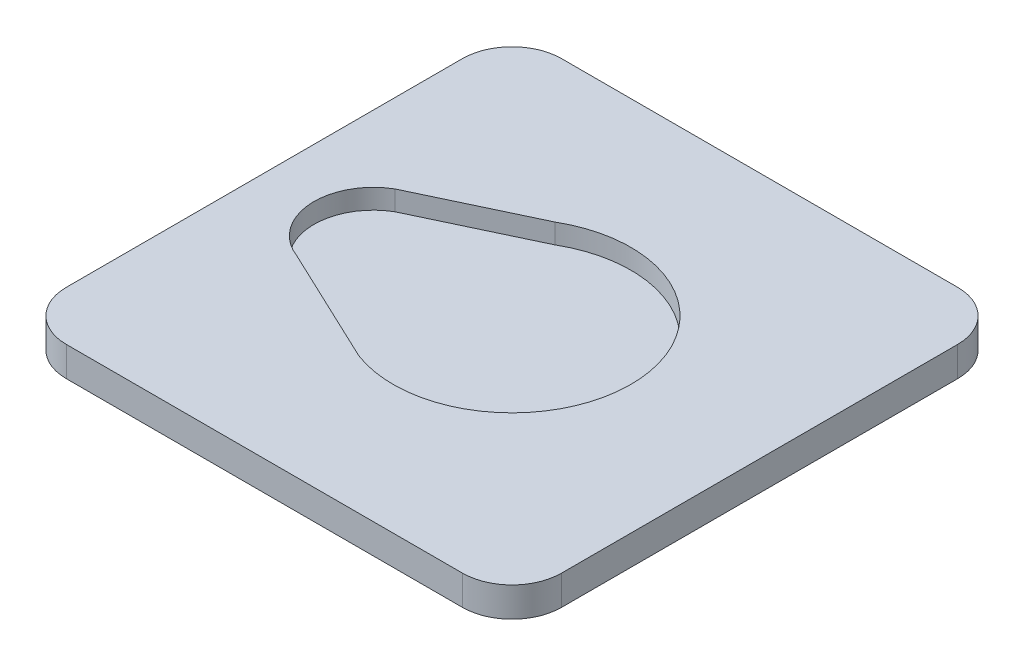
ISO-10303-21;
HEADER;
FILE_DESCRIPTION(('STEP AP214'),'2;1');
FILE_NAME('part.step','',(''),(''),'','','');
FILE_SCHEMA(('AUTOMOTIVE_DESIGN { 1 0 10303 214 1 1 1 1 }'));
ENDSEC;
DATA;
#1=APPLICATION_CONTEXT('core data for automotive mechanical design processes');
#2=APPLICATION_PROTOCOL_DEFINITION('international standard','automotive_design',2000,#1);
#3=PRODUCT_CONTEXT('',#1,'mechanical');
#4=PRODUCT('Part','Part','',(#3));
#5=PRODUCT_RELATED_PRODUCT_CATEGORY('part','',(#4));
#6=PRODUCT_DEFINITION_FORMATION('','',#4);
#7=PRODUCT_DEFINITION_CONTEXT('part definition',#1,'design');
#8=PRODUCT_DEFINITION('design','',#6,#7);
#9=PRODUCT_DEFINITION_SHAPE('','',#8);
#10=(LENGTH_UNIT() NAMED_UNIT(*) SI_UNIT(.MILLI.,.METRE.));
#11=(NAMED_UNIT(*) PLANE_ANGLE_UNIT() SI_UNIT($,.RADIAN.));
#12=(NAMED_UNIT(*) SI_UNIT($,.STERADIAN.) SOLID_ANGLE_UNIT());
#13=UNCERTAINTY_MEASURE_WITH_UNIT(LENGTH_MEASURE(1.E-05),#10,'distance_accuracy_value','');
#14=(GEOMETRIC_REPRESENTATION_CONTEXT(3) GLOBAL_UNCERTAINTY_ASSIGNED_CONTEXT((#13)) GLOBAL_UNIT_ASSIGNED_CONTEXT((#10,
#11,#12)) REPRESENTATION_CONTEXT('',''));
#15=CARTESIAN_POINT('',(0.,0.,0.));
#16=DIRECTION('',(0.,0.,1.));
#17=DIRECTION('',(1.,0.,0.));
#18=AXIS2_PLACEMENT_3D('',#15,#16,#17);
#19=CARTESIAN_POINT('',(0.,15.,0.));
#20=DIRECTION('',(0.,-1.,0.));
#21=DIRECTION('',(0.,0.,-1.));
#22=AXIS2_PLACEMENT_3D('',#19,#20,#21);
#23=CYLINDRICAL_SURFACE('',#22,60.);
#24=DIRECTION('',(0.,-1.,0.));
#25=VECTOR('',#24,1.);
#26=CARTESIAN_POINT('',(-30.0805669917219,15.,-51.9149254979388));
#27=LINE('',#26,#25);
#28=CARTESIAN_POINT('',(-30.0805669917219,15.,-51.9149254979388));
#29=VERTEX_POINT('',#28);
#30=CARTESIAN_POINT('',(-30.0805669917219,5.,-51.9149254979388));
#31=VERTEX_POINT('',#30);
#32=EDGE_CURVE('E210',#29,#31,#27,.T.);
#33=ORIENTED_EDGE('',*,*,#32,.T.);
#34=CARTESIAN_POINT('',(0.,5.,0.));
#35=DIRECTION('',(0.,-1.,0.));
#36=DIRECTION('',(0.,0.,-1.));
#37=AXIS2_PLACEMENT_3D('',#34,#35,#36);
#38=CIRCLE('',#37,60.);
#39=CARTESIAN_POINT('',(-21.1741904659975,5.,56.1395908259907));
#40=VERTEX_POINT('',#39);
#41=EDGE_CURVE('E189',#31,#40,#38,.T.);
#42=ORIENTED_EDGE('',*,*,#41,.T.);
#43=DIRECTION('',(0.,-1.,0.));
#44=VECTOR('',#43,1.);
#45=CARTESIAN_POINT('',(-21.1741904659976,15.,56.1395908259907));
#46=LINE('',#45,#44);
#47=CARTESIAN_POINT('',(-21.1741904659976,15.,56.1395908259907));
#48=VERTEX_POINT('',#47);
#49=EDGE_CURVE('E201',#48,#40,#46,.T.);
#50=ORIENTED_EDGE('',*,*,#49,.F.);
#51=CARTESIAN_POINT('',(0.,15.,0.));
#52=DIRECTION('',(0.,1.,0.));
#53=DIRECTION('',(0.,0.,1.));
#54=AXIS2_PLACEMENT_3D('',#51,#52,#53);
#55=CIRCLE('',#54,60.);
#56=EDGE_CURVE('E192',#48,#29,#55,.T.);
#57=ORIENTED_EDGE('',*,*,#56,.T.);
#58=EDGE_LOOP('',(#33,#42,#50,#57));
#59=FACE_BOUND('',#58,.T.);
#60=ADVANCED_FACE('F35',(#59),#23,.F.);
#61=CARTESIAN_POINT('',(-30.0805669917219,15.,-51.9149254979388));
#62=DIRECTION('',(0.427063656850554,0.,0.904221561895884));
#63=DIRECTION('',(0.904221561895884,0.,-0.427063656850554));
#64=AXIS2_PLACEMENT_3D('',#61,#62,#63);
#65=PLANE('',#64);
#66=DIRECTION('',(0.,-1.,0.));
#67=VECTOR('',#66,1.);
#68=CARTESIAN_POINT('',(-85.040283495861,15.,-25.9574627489694));
#69=LINE('',#68,#67);
#70=CARTESIAN_POINT('',(-85.040283495861,15.,-25.9574627489694));
#71=VERTEX_POINT('',#70);
#72=CARTESIAN_POINT('',(-85.040283495861,5.,-25.9574627489694));
#73=VERTEX_POINT('',#72);
#74=EDGE_CURVE('E207',#71,#73,#69,.T.);
#75=ORIENTED_EDGE('',*,*,#74,.T.);
#76=DIRECTION('',(0.904221561895884,0.,-0.427063656850554));
#77=VECTOR('',#76,1.);
#78=CARTESIAN_POINT('',(-30.0805669917219,5.,-51.9149254979388));
#79=LINE('',#78,#77);
#80=EDGE_CURVE('E186',#73,#31,#79,.T.);
#81=ORIENTED_EDGE('',*,*,#80,.T.);
#82=ORIENTED_EDGE('',*,*,#32,.F.);
#83=DIRECTION('',(-0.904221561895884,0.,0.427063656850554));
#84=VECTOR('',#83,1.);
#85=CARTESIAN_POINT('',(-30.0805669917219,15.,-51.9149254979388));
#86=LINE('',#85,#84);
#87=EDGE_CURVE('E194',#29,#71,#86,.T.);
#88=ORIENTED_EDGE('',*,*,#87,.T.);
#89=EDGE_LOOP('',(#75,#81,#82,#88));
#90=FACE_BOUND('',#89,.T.);
#91=ADVANCED_FACE('F320',(#90),#65,.T.);
#92=CARTESIAN_POINT('',(-70.0000000000001,15.,0.));
#93=DIRECTION('',(0.,-1.,0.));
#94=DIRECTION('',(0.,0.,-1.));
#95=AXIS2_PLACEMENT_3D('',#92,#93,#94);
#96=CYLINDRICAL_SURFACE('',#95,30.);
#97=DIRECTION('',(0.,-1.,0.));
#98=VECTOR('',#97,1.);
#99=CARTESIAN_POINT('',(-80.5870952329988,15.,28.0697954129954));
#100=LINE('',#99,#98);
#101=CARTESIAN_POINT('',(-80.5870952329988,15.,28.0697954129954));
#102=VERTEX_POINT('',#101);
#103=CARTESIAN_POINT('',(-80.5870952329988,5.,28.0697954129954));
#104=VERTEX_POINT('',#103);
#105=EDGE_CURVE('E204',#102,#104,#100,.T.);
#106=ORIENTED_EDGE('',*,*,#105,.T.);
#107=CARTESIAN_POINT('',(-70.0000000000001,5.,0.));
#108=DIRECTION('',(0.,-1.,0.));
#109=DIRECTION('',(0.,0.,-1.));
#110=AXIS2_PLACEMENT_3D('',#107,#108,#109);
#111=CIRCLE('',#110,30.);
#112=EDGE_CURVE('E58',#104,#73,#111,.T.);
#113=ORIENTED_EDGE('',*,*,#112,.T.);
#114=ORIENTED_EDGE('',*,*,#74,.F.);
#115=CARTESIAN_POINT('',(-70.0000000000001,15.,0.));
#116=DIRECTION('',(0.,1.,0.));
#117=DIRECTION('',(0.,0.,1.));
#118=AXIS2_PLACEMENT_3D('',#115,#116,#117);
#119=CIRCLE('',#118,30.);
#120=EDGE_CURVE('E196',#71,#102,#119,.T.);
#121=ORIENTED_EDGE('',*,*,#120,.T.);
#122=EDGE_LOOP('',(#106,#113,#114,#121));
#123=FACE_BOUND('',#122,.T.);
#124=ADVANCED_FACE('F322',(#123),#96,.F.);
#125=CARTESIAN_POINT('',(-80.5870952329988,15.,28.0697954129954));
#126=DIRECTION('',(0.427176792996559,0.,-0.904168119060374));
#127=DIRECTION('',(-0.904168119060374,0.,-0.427176792996559));
#128=AXIS2_PLACEMENT_3D('',#125,#126,#127);
#129=PLANE('',#128);
#130=ORIENTED_EDGE('',*,*,#49,.T.);
#131=DIRECTION('',(-0.904168119060374,0.,-0.427176792996559));
#132=VECTOR('',#131,1.);
#133=CARTESIAN_POINT('',(-80.5870952329988,5.,28.0697954129954));
#134=LINE('',#133,#132);
#135=EDGE_CURVE('E11',#40,#104,#134,.T.);
#136=ORIENTED_EDGE('',*,*,#135,.T.);
#137=ORIENTED_EDGE('',*,*,#105,.F.);
#138=DIRECTION('',(0.904168119060374,0.,0.427176792996559));
#139=VECTOR('',#138,1.);
#140=CARTESIAN_POINT('',(-80.5870952329988,15.,28.0697954129954));
#141=LINE('',#140,#139);
#142=EDGE_CURVE('E199',#102,#48,#141,.T.);
#143=ORIENTED_EDGE('',*,*,#142,.T.);
#144=EDGE_LOOP('',(#130,#136,#137,#143));
#145=FACE_BOUND('',#144,.T.);
#146=ADVANCED_FACE('F311',(#145),#129,.T.);
#147=CARTESIAN_POINT('',(100.,15.,100.));
#148=DIRECTION('',(0.,1.,0.));
#149=DIRECTION('',(0.,0.,1.));
#150=AXIS2_PLACEMENT_3D('',#147,#148,#149);
#151=PLANE('',#150);
#152=CARTESIAN_POINT('',(100.,15.,100.));
#153=DIRECTION('',(0.,1.,0.));
#154=DIRECTION('',(0.,0.,1.));
#155=AXIS2_PLACEMENT_3D('',#152,#153,#154);
#156=CIRCLE('',#155,25.);
#157=CARTESIAN_POINT('',(100.,15.,125.));
#158=VERTEX_POINT('',#157);
#159=CARTESIAN_POINT('',(125.,15.,100.));
#160=VERTEX_POINT('',#159);
#161=EDGE_CURVE('E214',#158,#160,#156,.T.);
#162=ORIENTED_EDGE('',*,*,#161,.T.);
#163=DIRECTION('',(0.,0.,-1.));
#164=VECTOR('',#163,1.);
#165=CARTESIAN_POINT('',(125.,15.,-100.));
#166=LINE('',#165,#164);
#167=CARTESIAN_POINT('',(125.,15.,-100.));
#168=VERTEX_POINT('',#167);
#169=EDGE_CURVE('E217',#160,#168,#166,.T.);
#170=ORIENTED_EDGE('',*,*,#169,.T.);
#171=CARTESIAN_POINT('',(100.,15.,-100.));
#172=DIRECTION('',(0.,1.,0.));
#173=DIRECTION('',(0.,0.,-1.));
#174=AXIS2_PLACEMENT_3D('',#171,#172,#173);
#175=CIRCLE('',#174,25.);
#176=CARTESIAN_POINT('',(100.,15.,-125.));
#177=VERTEX_POINT('',#176);
#178=EDGE_CURVE('E220',#168,#177,#175,.T.);
#179=ORIENTED_EDGE('',*,*,#178,.T.);
#180=DIRECTION('',(-1.,0.,0.));
#181=VECTOR('',#180,1.);
#182=CARTESIAN_POINT('',(-100.,15.,-125.));
#183=LINE('',#182,#181);
#184=CARTESIAN_POINT('',(-100.,15.,-125.));
#185=VERTEX_POINT('',#184);
#186=EDGE_CURVE('E222',#177,#185,#183,.T.);
#187=ORIENTED_EDGE('',*,*,#186,.T.);
#188=CARTESIAN_POINT('',(-100.,15.,-100.));
#189=DIRECTION('',(0.,1.,0.));
#190=DIRECTION('',(0.,0.,-1.));
#191=AXIS2_PLACEMENT_3D('',#188,#189,#190);
#192=CIRCLE('',#191,25.);
#193=CARTESIAN_POINT('',(-125.,15.,-100.));
#194=VERTEX_POINT('',#193);
#195=EDGE_CURVE('E224',#185,#194,#192,.T.);
#196=ORIENTED_EDGE('',*,*,#195,.T.);
#197=DIRECTION('',(0.,0.,1.));
#198=VECTOR('',#197,1.);
#199=CARTESIAN_POINT('',(-125.,15.,-100.));
#200=LINE('',#199,#198);
#201=CARTESIAN_POINT('',(-125.,15.,100.));
#202=VERTEX_POINT('',#201);
#203=EDGE_CURVE('E226',#194,#202,#200,.T.);
#204=ORIENTED_EDGE('',*,*,#203,.T.);
#205=CARTESIAN_POINT('',(-100.,15.,100.));
#206=DIRECTION('',(0.,1.,0.));
#207=DIRECTION('',(0.,0.,1.));
#208=AXIS2_PLACEMENT_3D('',#205,#206,#207);
#209=CIRCLE('',#208,25.);
#210=CARTESIAN_POINT('',(-100.,15.,125.));
#211=VERTEX_POINT('',#210);
#212=EDGE_CURVE('E228',#202,#211,#209,.T.);
#213=ORIENTED_EDGE('',*,*,#212,.T.);
#214=DIRECTION('',(1.,0.,0.));
#215=VECTOR('',#214,1.);
#216=CARTESIAN_POINT('',(-100.,15.,125.));
#217=LINE('',#216,#215);
#218=EDGE_CURVE('E230',#211,#158,#217,.T.);
#219=ORIENTED_EDGE('',*,*,#218,.T.);
#220=EDGE_LOOP('',(#162,#170,#179,#187,#196,#204,#213,#219));
#221=FACE_BOUND('',#220,.T.);
#222=ORIENTED_EDGE('',*,*,#87,.F.);
#223=ORIENTED_EDGE('',*,*,#56,.F.);
#224=ORIENTED_EDGE('',*,*,#142,.F.);
#225=ORIENTED_EDGE('',*,*,#120,.F.);
#226=EDGE_LOOP('',(#222,#223,#224,#225));
#227=FACE_BOUND('',#226,.T.);
#228=ADVANCED_FACE('F308',(#221,#227),#151,.T.);
#229=CARTESIAN_POINT('',(100.,0.,100.));
#230=DIRECTION('',(0.,1.,0.));
#231=DIRECTION('',(0.,0.,1.));
#232=AXIS2_PLACEMENT_3D('',#229,#230,#231);
#233=PLANE('',#232);
#234=DIRECTION('',(-1.,0.,0.));
#235=VECTOR('',#234,1.);
#236=CARTESIAN_POINT('',(100.,0.,100.));
#237=LINE('',#236,#235);
#238=CARTESIAN_POINT('',(100.,0.,100.));
#239=VERTEX_POINT('',#238);
#240=CARTESIAN_POINT('',(-100.,0.,100.));
#241=VERTEX_POINT('',#240);
#242=EDGE_CURVE('E176',#239,#241,#237,.T.);
#243=ORIENTED_EDGE('',*,*,#242,.F.);
#244=DIRECTION('',(0.,0.,1.));
#245=VECTOR('',#244,1.);
#246=CARTESIAN_POINT('',(100.,0.,-100.));
#247=LINE('',#246,#245);
#248=CARTESIAN_POINT('',(100.,0.,-100.));
#249=VERTEX_POINT('',#248);
#250=EDGE_CURVE('E50',#249,#239,#247,.T.);
#251=ORIENTED_EDGE('',*,*,#250,.F.);
#252=DIRECTION('',(1.,0.,0.));
#253=VECTOR('',#252,1.);
#254=CARTESIAN_POINT('',(-100.,0.,-100.));
#255=LINE('',#254,#253);
#256=CARTESIAN_POINT('',(-100.,0.,-100.));
#257=VERTEX_POINT('',#256);
#258=EDGE_CURVE('E167',#257,#249,#255,.T.);
#259=ORIENTED_EDGE('',*,*,#258,.F.);
#260=DIRECTION('',(0.,0.,-1.));
#261=VECTOR('',#260,1.);
#262=CARTESIAN_POINT('',(-100.,0.,100.));
#263=LINE('',#262,#261);
#264=EDGE_CURVE('E170',#241,#257,#263,.T.);
#265=ORIENTED_EDGE('',*,*,#264,.F.);
#266=EDGE_LOOP('',(#243,#251,#259,#265));
#267=FACE_BOUND('',#266,.T.);
#268=CARTESIAN_POINT('',(100.,0.,100.));
#269=DIRECTION('',(0.,1.,0.));
#270=DIRECTION('',(0.,0.,1.));
#271=AXIS2_PLACEMENT_3D('',#268,#269,#270);
#272=CIRCLE('',#271,25.);
#273=CARTESIAN_POINT('',(100.,0.,125.));
#274=VERTEX_POINT('',#273);
#275=CARTESIAN_POINT('',(125.,0.,100.));
#276=VERTEX_POINT('',#275);
#277=EDGE_CURVE('E213',#274,#276,#272,.T.);
#278=ORIENTED_EDGE('',*,*,#277,.F.);
#279=DIRECTION('',(1.,0.,0.));
#280=VECTOR('',#279,1.);
#281=CARTESIAN_POINT('',(-100.,0.,125.));
#282=LINE('',#281,#280);
#283=CARTESIAN_POINT('',(-100.,0.,125.));
#284=VERTEX_POINT('',#283);
#285=EDGE_CURVE('E218',#284,#274,#282,.T.);
#286=ORIENTED_EDGE('',*,*,#285,.F.);
#287=CARTESIAN_POINT('',(-100.,0.,100.));
#288=DIRECTION('',(0.,1.,0.));
#289=DIRECTION('',(0.,0.,1.));
#290=AXIS2_PLACEMENT_3D('',#287,#288,#289);
#291=CIRCLE('',#290,25.);
#292=CARTESIAN_POINT('',(-125.,0.,100.));
#293=VERTEX_POINT('',#292);
#294=EDGE_CURVE('E250',#293,#284,#291,.T.);
#295=ORIENTED_EDGE('',*,*,#294,.F.);
#296=DIRECTION('',(0.,0.,1.));
#297=VECTOR('',#296,1.);
#298=CARTESIAN_POINT('',(-125.,0.,-100.));
#299=LINE('',#298,#297);
#300=CARTESIAN_POINT('',(-125.,0.,-100.));
#301=VERTEX_POINT('',#300);
#302=EDGE_CURVE('E247',#301,#293,#299,.T.);
#303=ORIENTED_EDGE('',*,*,#302,.F.);
#304=CARTESIAN_POINT('',(-100.,0.,-100.));
#305=DIRECTION('',(0.,1.,0.));
#306=DIRECTION('',(0.,0.,-1.));
#307=AXIS2_PLACEMENT_3D('',#304,#305,#306);
#308=CIRCLE('',#307,25.);
#309=CARTESIAN_POINT('',(-100.,0.,-125.));
#310=VERTEX_POINT('',#309);
#311=EDGE_CURVE('E244',#310,#301,#308,.T.);
#312=ORIENTED_EDGE('',*,*,#311,.F.);
#313=DIRECTION('',(-1.,0.,0.));
#314=VECTOR('',#313,1.);
#315=CARTESIAN_POINT('',(-100.,0.,-125.));
#316=LINE('',#315,#314);
#317=CARTESIAN_POINT('',(100.,0.,-125.));
#318=VERTEX_POINT('',#317);
#319=EDGE_CURVE('E241',#318,#310,#316,.T.);
#320=ORIENTED_EDGE('',*,*,#319,.F.);
#321=CARTESIAN_POINT('',(100.,0.,-100.));
#322=DIRECTION('',(0.,1.,0.));
#323=DIRECTION('',(0.,0.,-1.));
#324=AXIS2_PLACEMENT_3D('',#321,#322,#323);
#325=CIRCLE('',#324,25.);
#326=CARTESIAN_POINT('',(125.,0.,-100.));
#327=VERTEX_POINT('',#326);
#328=EDGE_CURVE('E238',#327,#318,#325,.T.);
#329=ORIENTED_EDGE('',*,*,#328,.F.);
#330=DIRECTION('',(0.,0.,-1.));
#331=VECTOR('',#330,1.);
#332=CARTESIAN_POINT('',(125.,0.,-100.));
#333=LINE('',#332,#331);
#334=EDGE_CURVE('E235',#276,#327,#333,.T.);
#335=ORIENTED_EDGE('',*,*,#334,.F.);
#336=EDGE_LOOP('',(#278,#286,#295,#303,#312,#320,#329,#335));
#337=FACE_BOUND('',#336,.T.);
#338=ADVANCED_FACE('F277',(#267,#337),#233,.F.);
#339=CARTESIAN_POINT('',(100.,15.,100.));
#340=DIRECTION('',(0.,-1.,0.));
#341=DIRECTION('',(0.,0.,-1.));
#342=AXIS2_PLACEMENT_3D('',#339,#340,#341);
#343=CYLINDRICAL_SURFACE('',#342,25.);
#344=ORIENTED_EDGE('',*,*,#277,.T.);
#345=DIRECTION('',(0.,-1.,0.));
#346=VECTOR('',#345,1.);
#347=CARTESIAN_POINT('',(125.,15.,100.));
#348=LINE('',#347,#346);
#349=EDGE_CURVE('E43',#160,#276,#348,.T.);
#350=ORIENTED_EDGE('',*,*,#349,.F.);
#351=ORIENTED_EDGE('',*,*,#161,.F.);
#352=DIRECTION('',(0.,-1.,0.));
#353=VECTOR('',#352,1.);
#354=CARTESIAN_POINT('',(100.,15.,125.));
#355=LINE('',#354,#353);
#356=EDGE_CURVE('E232',#158,#274,#355,.T.);
#357=ORIENTED_EDGE('',*,*,#356,.T.);
#358=EDGE_LOOP('',(#344,#350,#351,#357));
#359=FACE_BOUND('',#358,.T.);
#360=ADVANCED_FACE('F37',(#359),#343,.T.);
#361=CARTESIAN_POINT('',(125.,15.,-100.));
#362=DIRECTION('',(-1.,0.,0.));
#363=DIRECTION('',(0.,0.,1.));
#364=AXIS2_PLACEMENT_3D('',#361,#362,#363);
#365=PLANE('',#364);
#366=ORIENTED_EDGE('',*,*,#334,.T.);
#367=DIRECTION('',(0.,-1.,0.));
#368=VECTOR('',#367,1.);
#369=CARTESIAN_POINT('',(125.,15.,-100.));
#370=LINE('',#369,#368);
#371=EDGE_CURVE('E266',#168,#327,#370,.T.);
#372=ORIENTED_EDGE('',*,*,#371,.F.);
#373=ORIENTED_EDGE('',*,*,#169,.F.);
#374=ORIENTED_EDGE('',*,*,#349,.T.);
#375=EDGE_LOOP('',(#366,#372,#373,#374));
#376=FACE_BOUND('',#375,.T.);
#377=ADVANCED_FACE('F270',(#376),#365,.F.);
#378=CARTESIAN_POINT('',(100.,15.,-100.));
#379=DIRECTION('',(0.,-1.,0.));
#380=DIRECTION('',(0.,0.,-1.));
#381=AXIS2_PLACEMENT_3D('',#378,#379,#380);
#382=CYLINDRICAL_SURFACE('',#381,25.);
#383=ORIENTED_EDGE('',*,*,#328,.T.);
#384=DIRECTION('',(0.,-1.,0.));
#385=VECTOR('',#384,1.);
#386=CARTESIAN_POINT('',(100.,15.,-125.));
#387=LINE('',#386,#385);
#388=EDGE_CURVE('E264',#177,#318,#387,.T.);
#389=ORIENTED_EDGE('',*,*,#388,.F.);
#390=ORIENTED_EDGE('',*,*,#178,.F.);
#391=ORIENTED_EDGE('',*,*,#371,.T.);
#392=EDGE_LOOP('',(#383,#389,#390,#391));
#393=FACE_BOUND('',#392,.T.);
#394=ADVANCED_FACE('F306',(#393),#382,.T.);
#395=CARTESIAN_POINT('',(-100.,15.,-125.));
#396=DIRECTION('',(0.,0.,1.));
#397=DIRECTION('',(1.,0.,0.));
#398=AXIS2_PLACEMENT_3D('',#395,#396,#397);
#399=PLANE('',#398);
#400=ORIENTED_EDGE('',*,*,#319,.T.);
#401=DIRECTION('',(0.,-1.,0.));
#402=VECTOR('',#401,1.);
#403=CARTESIAN_POINT('',(-100.,15.,-125.));
#404=LINE('',#403,#402);
#405=EDGE_CURVE('E262',#185,#310,#404,.T.);
#406=ORIENTED_EDGE('',*,*,#405,.F.);
#407=ORIENTED_EDGE('',*,*,#186,.F.);
#408=ORIENTED_EDGE('',*,*,#388,.T.);
#409=EDGE_LOOP('',(#400,#406,#407,#408));
#410=FACE_BOUND('',#409,.T.);
#411=ADVANCED_FACE('F301',(#410),#399,.F.);
#412=CARTESIAN_POINT('',(-100.,15.,-100.));
#413=DIRECTION('',(0.,-1.,0.));
#414=DIRECTION('',(0.,0.,-1.));
#415=AXIS2_PLACEMENT_3D('',#412,#413,#414);
#416=CYLINDRICAL_SURFACE('',#415,25.);
#417=ORIENTED_EDGE('',*,*,#311,.T.);
#418=DIRECTION('',(0.,-1.,0.));
#419=VECTOR('',#418,1.);
#420=CARTESIAN_POINT('',(-125.,15.,-100.));
#421=LINE('',#420,#419);
#422=EDGE_CURVE('E260',#194,#301,#421,.T.);
#423=ORIENTED_EDGE('',*,*,#422,.F.);
#424=ORIENTED_EDGE('',*,*,#195,.F.);
#425=ORIENTED_EDGE('',*,*,#405,.T.);
#426=EDGE_LOOP('',(#417,#423,#424,#425));
#427=FACE_BOUND('',#426,.T.);
#428=ADVANCED_FACE('F298',(#427),#416,.T.);
#429=CARTESIAN_POINT('',(-125.,15.,-100.));
#430=DIRECTION('',(1.,0.,0.));
#431=DIRECTION('',(0.,0.,-1.));
#432=AXIS2_PLACEMENT_3D('',#429,#430,#431);
#433=PLANE('',#432);
#434=ORIENTED_EDGE('',*,*,#302,.T.);
#435=DIRECTION('',(0.,-1.,0.));
#436=VECTOR('',#435,1.);
#437=CARTESIAN_POINT('',(-125.,15.,100.));
#438=LINE('',#437,#436);
#439=EDGE_CURVE('E258',#202,#293,#438,.T.);
#440=ORIENTED_EDGE('',*,*,#439,.F.);
#441=ORIENTED_EDGE('',*,*,#203,.F.);
#442=ORIENTED_EDGE('',*,*,#422,.T.);
#443=EDGE_LOOP('',(#434,#440,#441,#442));
#444=FACE_BOUND('',#443,.T.);
#445=ADVANCED_FACE('F294',(#444),#433,.F.);
#446=CARTESIAN_POINT('',(-100.,15.,100.));
#447=DIRECTION('',(0.,-1.,0.));
#448=DIRECTION('',(0.,0.,-1.));
#449=AXIS2_PLACEMENT_3D('',#446,#447,#448);
#450=CYLINDRICAL_SURFACE('',#449,25.);
#451=ORIENTED_EDGE('',*,*,#294,.T.);
#452=DIRECTION('',(0.,-1.,0.));
#453=VECTOR('',#452,1.);
#454=CARTESIAN_POINT('',(-100.,15.,125.));
#455=LINE('',#454,#453);
#456=EDGE_CURVE('E256',#211,#284,#455,.T.);
#457=ORIENTED_EDGE('',*,*,#456,.F.);
#458=ORIENTED_EDGE('',*,*,#212,.F.);
#459=ORIENTED_EDGE('',*,*,#439,.T.);
#460=EDGE_LOOP('',(#451,#457,#458,#459));
#461=FACE_BOUND('',#460,.T.);
#462=ADVANCED_FACE('F289',(#461),#450,.T.);
#463=CARTESIAN_POINT('',(-100.,15.,125.));
#464=DIRECTION('',(0.,0.,-1.));
#465=DIRECTION('',(-1.,0.,0.));
#466=AXIS2_PLACEMENT_3D('',#463,#464,#465);
#467=PLANE('',#466);
#468=ORIENTED_EDGE('',*,*,#285,.T.);
#469=ORIENTED_EDGE('',*,*,#356,.F.);
#470=ORIENTED_EDGE('',*,*,#218,.F.);
#471=ORIENTED_EDGE('',*,*,#456,.T.);
#472=EDGE_LOOP('',(#468,#469,#470,#471));
#473=FACE_BOUND('',#472,.T.);
#474=ADVANCED_FACE('F283',(#473),#467,.F.);
#475=CARTESIAN_POINT('',(100.,5.,100.));
#476=DIRECTION('',(0.,-1.,0.));
#477=DIRECTION('',(0.,0.,-1.));
#478=AXIS2_PLACEMENT_3D('',#475,#476,#477);
#479=PLANE('',#478);
#480=ORIENTED_EDGE('',*,*,#41,.F.);
#481=ORIENTED_EDGE('',*,*,#80,.F.);
#482=ORIENTED_EDGE('',*,*,#112,.F.);
#483=ORIENTED_EDGE('',*,*,#135,.F.);
#484=EDGE_LOOP('',(#480,#481,#482,#483));
#485=FACE_BOUND('',#484,.T.);
#486=ADVANCED_FACE('F325',(#485),#479,.F.);
#487=CARTESIAN_POINT('',(100.,1.,-100.));
#488=DIRECTION('',(1.,0.,0.));
#489=DIRECTION('',(0.,0.,-1.));
#490=AXIS2_PLACEMENT_3D('',#487,#488,#489);
#491=PLANE('',#490);
#492=ORIENTED_EDGE('',*,*,#250,.T.);
#493=DIRECTION('',(0.,-1.,0.));
#494=VECTOR('',#493,1.);
#495=CARTESIAN_POINT('',(100.,1.,100.));
#496=LINE('',#495,#494);
#497=CARTESIAN_POINT('',(100.,1.,100.));
#498=VERTEX_POINT('',#497);
#499=EDGE_CURVE('E145',#498,#239,#496,.T.);
#500=ORIENTED_EDGE('',*,*,#499,.F.);
#501=DIRECTION('',(0.,0.,1.));
#502=VECTOR('',#501,1.);
#503=CARTESIAN_POINT('',(100.,1.,-100.));
#504=LINE('',#503,#502);
#505=CARTESIAN_POINT('',(100.,1.,-100.));
#506=VERTEX_POINT('',#505);
#507=EDGE_CURVE('E149',#506,#498,#504,.T.);
#508=ORIENTED_EDGE('',*,*,#507,.F.);
#509=DIRECTION('',(0.,-1.,0.));
#510=VECTOR('',#509,1.);
#511=CARTESIAN_POINT('',(100.,1.,-100.));
#512=LINE('',#511,#510);
#513=EDGE_CURVE('E180',#506,#249,#512,.T.);
#514=ORIENTED_EDGE('',*,*,#513,.T.);
#515=EDGE_LOOP('',(#492,#500,#508,#514));
#516=FACE_BOUND('',#515,.T.);
#517=ADVANCED_FACE('F147',(#516),#491,.F.);
#518=CARTESIAN_POINT('',(-100.,1.,-100.));
#519=DIRECTION('',(0.,0.,-1.));
#520=DIRECTION('',(-1.,0.,0.));
#521=AXIS2_PLACEMENT_3D('',#518,#519,#520);
#522=PLANE('',#521);
#523=ORIENTED_EDGE('',*,*,#258,.T.);
#524=ORIENTED_EDGE('',*,*,#513,.F.);
#525=DIRECTION('',(1.,0.,0.));
#526=VECTOR('',#525,1.);
#527=CARTESIAN_POINT('',(-100.,1.,-100.));
#528=LINE('',#527,#526);
#529=CARTESIAN_POINT('',(-100.,1.,-100.));
#530=VERTEX_POINT('',#529);
#531=EDGE_CURVE('E155',#530,#506,#528,.T.);
#532=ORIENTED_EDGE('',*,*,#531,.F.);
#533=DIRECTION('',(0.,-1.,0.));
#534=VECTOR('',#533,1.);
#535=CARTESIAN_POINT('',(-100.,1.,-100.));
#536=LINE('',#535,#534);
#537=EDGE_CURVE('E182',#530,#257,#536,.T.);
#538=ORIENTED_EDGE('',*,*,#537,.T.);
#539=EDGE_LOOP('',(#523,#524,#532,#538));
#540=FACE_BOUND('',#539,.T.);
#541=ADVANCED_FACE('F411',(#540),#522,.F.);
#542=CARTESIAN_POINT('',(-100.,1.,100.));
#543=DIRECTION('',(-1.,0.,0.));
#544=DIRECTION('',(0.,0.,1.));
#545=AXIS2_PLACEMENT_3D('',#542,#543,#544);
#546=PLANE('',#545);
#547=ORIENTED_EDGE('',*,*,#264,.T.);
#548=ORIENTED_EDGE('',*,*,#537,.F.);
#549=DIRECTION('',(0.,0.,-1.));
#550=VECTOR('',#549,1.);
#551=CARTESIAN_POINT('',(-100.,1.,100.));
#552=LINE('',#551,#550);
#553=CARTESIAN_POINT('',(-100.,1.,100.));
#554=VERTEX_POINT('',#553);
#555=EDGE_CURVE('E163',#554,#530,#552,.T.);
#556=ORIENTED_EDGE('',*,*,#555,.F.);
#557=DIRECTION('',(0.,-1.,0.));
#558=VECTOR('',#557,1.);
#559=CARTESIAN_POINT('',(-100.,1.,100.));
#560=LINE('',#559,#558);
#561=EDGE_CURVE('E154',#554,#241,#560,.T.);
#562=ORIENTED_EDGE('',*,*,#561,.T.);
#563=EDGE_LOOP('',(#547,#548,#556,#562));
#564=FACE_BOUND('',#563,.T.);
#565=ADVANCED_FACE('F419',(#564),#546,.F.);
#566=CARTESIAN_POINT('',(100.,1.,100.));
#567=DIRECTION('',(0.,0.,1.));
#568=DIRECTION('',(1.,0.,0.));
#569=AXIS2_PLACEMENT_3D('',#566,#567,#568);
#570=PLANE('',#569);
#571=ORIENTED_EDGE('',*,*,#242,.T.);
#572=ORIENTED_EDGE('',*,*,#561,.F.);
#573=DIRECTION('',(-1.,0.,0.));
#574=VECTOR('',#573,1.);
#575=CARTESIAN_POINT('',(100.,1.,100.));
#576=LINE('',#575,#574);
#577=EDGE_CURVE('E158',#498,#554,#576,.T.);
#578=ORIENTED_EDGE('',*,*,#577,.F.);
#579=ORIENTED_EDGE('',*,*,#499,.T.);
#580=EDGE_LOOP('',(#571,#572,#578,#579));
#581=FACE_BOUND('',#580,.T.);
#582=ADVANCED_FACE('F159',(#581),#570,.F.);
#583=CARTESIAN_POINT('',(0.,1.,0.));
#584=DIRECTION('',(0.,-1.,0.));
#585=DIRECTION('',(0.,0.,-1.));
#586=AXIS2_PLACEMENT_3D('',#583,#584,#585);
#587=PLANE('',#586);
#588=ORIENTED_EDGE('',*,*,#507,.T.);
#589=ORIENTED_EDGE('',*,*,#577,.T.);
#590=ORIENTED_EDGE('',*,*,#555,.T.);
#591=ORIENTED_EDGE('',*,*,#531,.T.);
#592=EDGE_LOOP('',(#588,#589,#590,#591));
#593=FACE_BOUND('',#592,.T.);
#594=ADVANCED_FACE('F165',(#593),#587,.T.);
#595=CLOSED_SHELL('',(#60,#91,#124,#146,#228,#338,#360,#377,#394,#411,#428,#445,#462,#474,#486,
#517,#541,#565,#582,#594));
#596=MANIFOLD_SOLID_BREP('B2',#595);
#597=ADVANCED_BREP_SHAPE_REPRESENTATION('',(#18,#596),#14);
#598=SHAPE_DEFINITION_REPRESENTATION(#9,#597);
ENDSEC;
END-ISO-10303-21;
